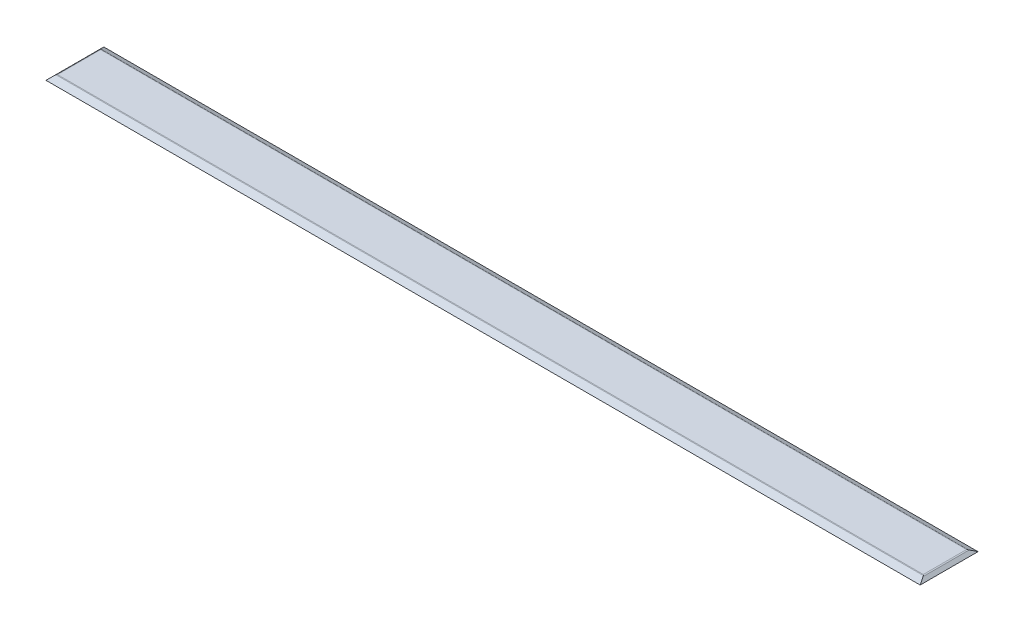
ISO-10303-21;
HEADER;
FILE_DESCRIPTION(('STEP AP214'),'2;1');
FILE_NAME('part.step','',(''),(''),'','','');
FILE_SCHEMA(('AUTOMOTIVE_DESIGN { 1 0 10303 214 1 1 1 1 }'));
ENDSEC;
DATA;
#1=APPLICATION_CONTEXT('core data for automotive mechanical design processes');
#2=APPLICATION_PROTOCOL_DEFINITION('international standard','automotive_design',2000,#1);
#3=PRODUCT_CONTEXT('',#1,'mechanical');
#4=PRODUCT('Part','Part','',(#3));
#5=PRODUCT_RELATED_PRODUCT_CATEGORY('part','',(#4));
#6=PRODUCT_DEFINITION_FORMATION('','',#4);
#7=PRODUCT_DEFINITION_CONTEXT('part definition',#1,'design');
#8=PRODUCT_DEFINITION('design','',#6,#7);
#9=PRODUCT_DEFINITION_SHAPE('','',#8);
#10=(LENGTH_UNIT() NAMED_UNIT(*) SI_UNIT(.MILLI.,.METRE.));
#11=(NAMED_UNIT(*) PLANE_ANGLE_UNIT() SI_UNIT($,.RADIAN.));
#12=(NAMED_UNIT(*) SI_UNIT($,.STERADIAN.) SOLID_ANGLE_UNIT());
#13=UNCERTAINTY_MEASURE_WITH_UNIT(LENGTH_MEASURE(1.E-05),#10,'distance_accuracy_value','');
#14=(GEOMETRIC_REPRESENTATION_CONTEXT(3) GLOBAL_UNCERTAINTY_ASSIGNED_CONTEXT((#13)) GLOBAL_UNIT_ASSIGNED_CONTEXT((#10,
#11,#12)) REPRESENTATION_CONTEXT('',''));
#15=CARTESIAN_POINT('',(0.,0.,0.));
#16=DIRECTION('',(0.,0.,1.));
#17=DIRECTION('',(1.,0.,0.));
#18=AXIS2_PLACEMENT_3D('',#15,#16,#17);
#19=CARTESIAN_POINT('',(1270.,-10.,84.));
#20=DIRECTION('',(0.,1.,0.));
#21=DIRECTION('',(0.,0.,1.));
#22=AXIS2_PLACEMENT_3D('',#19,#20,#21);
#23=PLANE('',#22);
#24=DIRECTION('',(0.,0.,-1.));
#25=VECTOR('',#24,1.);
#26=CARTESIAN_POINT('',(-1270.,-10.,84.));
#27=LINE('',#26,#25);
#28=CARTESIAN_POINT('',(-1270.,-10.,84.));
#29=VERTEX_POINT('',#28);
#30=CARTESIAN_POINT('',(-1270.,-10.,-84.));
#31=VERTEX_POINT('',#30);
#32=EDGE_CURVE('E237',#29,#31,#27,.T.);
#33=ORIENTED_EDGE('',*,*,#32,.T.);
#34=DIRECTION('',(-1.,0.,0.));
#35=VECTOR('',#34,1.);
#36=CARTESIAN_POINT('',(1270.,-10.,-84.));
#37=LINE('',#36,#35);
#38=CARTESIAN_POINT('',(1270.,-10.,-84.));
#39=VERTEX_POINT('',#38);
#40=EDGE_CURVE('E242',#39,#31,#37,.T.);
#41=ORIENTED_EDGE('',*,*,#40,.F.);
#42=DIRECTION('',(0.,0.,-1.));
#43=VECTOR('',#42,1.);
#44=CARTESIAN_POINT('',(1270.,-10.,84.));
#45=LINE('',#44,#43);
#46=CARTESIAN_POINT('',(1270.,-10.,84.));
#47=VERTEX_POINT('',#46);
#48=EDGE_CURVE('E233',#47,#39,#45,.T.);
#49=ORIENTED_EDGE('',*,*,#48,.F.);
#50=DIRECTION('',(-1.,0.,0.));
#51=VECTOR('',#50,1.);
#52=CARTESIAN_POINT('',(1270.,-10.,84.));
#53=LINE('',#52,#51);
#54=EDGE_CURVE('E236',#47,#29,#53,.T.);
#55=ORIENTED_EDGE('',*,*,#54,.T.);
#56=EDGE_LOOP('',(#33,#41,#49,#55));
#57=FACE_BOUND('',#56,.T.);
#58=DIRECTION('',(0.,0.,-1.));
#59=VECTOR('',#58,1.);
#60=CARTESIAN_POINT('',(-1268.58578643763,-10.,64.));
#61=LINE('',#60,#59);
#62=CARTESIAN_POINT('',(-1268.58578643763,-10.,81.7639320225002));
#63=VERTEX_POINT('',#62);
#64=CARTESIAN_POINT('',(-1268.58578643763,-10.,-81.7639320225002));
#65=VERTEX_POINT('',#64);
#66=EDGE_CURVE('E224',#63,#65,#61,.T.);
#67=ORIENTED_EDGE('',*,*,#66,.F.);
#68=DIRECTION('',(-1.,0.,0.));
#69=VECTOR('',#68,1.);
#70=CARTESIAN_POINT('',(1270.,-10.,81.7639320225002));
#71=LINE('',#70,#69);
#72=CARTESIAN_POINT('',(1268.58578643763,-10.,81.7639320225002));
#73=VERTEX_POINT('',#72);
#74=EDGE_CURVE('E228',#73,#63,#71,.T.);
#75=ORIENTED_EDGE('',*,*,#74,.F.);
#76=DIRECTION('',(0.,0.,1.));
#77=VECTOR('',#76,1.);
#78=CARTESIAN_POINT('',(1268.58578643763,-10.,84.));
#79=LINE('',#78,#77);
#80=CARTESIAN_POINT('',(1268.58578643763,-10.,-81.7639320225002));
#81=VERTEX_POINT('',#80);
#82=EDGE_CURVE('E65',#73,#81,#79,.F.);
#83=ORIENTED_EDGE('',*,*,#82,.T.);
#84=DIRECTION('',(-1.,0.,0.));
#85=VECTOR('',#84,1.);
#86=CARTESIAN_POINT('',(1270.,-10.,-81.7639320225002));
#87=LINE('',#86,#85);
#88=EDGE_CURVE('E208',#81,#65,#87,.T.);
#89=ORIENTED_EDGE('',*,*,#88,.T.);
#90=EDGE_LOOP('',(#67,#75,#83,#89));
#91=FACE_BOUND('',#90,.T.);
#92=ADVANCED_FACE('F48',(#57,#91),#23,.F.);
#93=CARTESIAN_POINT('',(1270.,0.,-64.));
#94=DIRECTION('',(0.,-0.894427190999916,0.447213595499957));
#95=DIRECTION('',(0.,-0.447213595499957,-0.894427190999916));
#96=AXIS2_PLACEMENT_3D('',#93,#94,#95);
#97=PLANE('',#96);
#98=DIRECTION('',(-1.,0.,0.));
#99=VECTOR('',#98,1.);
#100=CARTESIAN_POINT('',(1270.,-0.527864045000381,-65.0557280900008));
#101=LINE('',#100,#99);
#102=CARTESIAN_POINT('',(-1260.16500016563,-0.527864045000381,-65.0557280900008));
#103=VERTEX_POINT('',#102);
#104=CARTESIAN_POINT('',(1260.16500016563,-0.527864045000381,-65.0557280900008));
#105=VERTEX_POINT('',#104);
#106=EDGE_CURVE('E262',#103,#105,#101,.F.);
#107=ORIENTED_EDGE('',*,*,#106,.T.);
#108=CARTESIAN_POINT('',(1257.92893218813,-5.,-74.));
#109=DIRECTION('',(0.,-0.894427190999916,0.447213595499957));
#110=DIRECTION('',(0.,-0.447213595499957,-0.894427190999916));
#111=AXIS2_PLACEMENT_3D('',#108,#109,#110);
#112=ELLIPSE('',#111,11.180339887499,5.);
#113=CARTESIAN_POINT('',(1261.46446609407,-1.46446609406725,-66.9289321881345));
#114=VERTEX_POINT('',#113);
#115=EDGE_CURVE('E266',#105,#114,#112,.F.);
#116=ORIENTED_EDGE('',*,*,#115,.T.);
#117=DIRECTION('',(-0.408248290463863,0.408248290463862,0.816496580927727));
#118=VECTOR('',#117,1.);
#119=CARTESIAN_POINT('',(1242.,18.,-27.9999999999999));
#120=LINE('',#119,#118);
#121=EDGE_CURVE('E248',#114,#39,#120,.F.);
#122=ORIENTED_EDGE('',*,*,#121,.T.);
#123=ORIENTED_EDGE('',*,*,#40,.T.);
#124=DIRECTION('',(0.408248290463855,0.408248290463864,0.81649658092773));
#125=VECTOR('',#124,1.);
#126=CARTESIAN_POINT('',(-1217.33333333333,42.666666666667,21.3333333333341));
#127=LINE('',#126,#125);
#128=CARTESIAN_POINT('',(-1261.46446609407,-1.46446609406725,-66.9289321881346));
#129=VERTEX_POINT('',#128);
#130=EDGE_CURVE('E250',#31,#129,#127,.T.);
#131=ORIENTED_EDGE('',*,*,#130,.T.);
#132=CARTESIAN_POINT('',(-1257.92893218813,-5.,-74.));
#133=DIRECTION('',(0.,-0.894427190999916,0.447213595499957));
#134=DIRECTION('',(0.,-0.447213595499957,-0.894427190999916));
#135=AXIS2_PLACEMENT_3D('',#132,#133,#134);
#136=ELLIPSE('',#135,11.180339887499,5.);
#137=EDGE_CURVE('E264',#129,#103,#136,.F.);
#138=ORIENTED_EDGE('',*,*,#137,.T.);
#139=EDGE_LOOP('',(#107,#116,#122,#123,#131,#138));
#140=FACE_BOUND('',#139,.T.);
#141=ADVANCED_FACE('F320',(#140),#97,.F.);
#142=CARTESIAN_POINT('',(1270.,0.,64.));
#143=DIRECTION('',(0.,-1.,0.));
#144=DIRECTION('',(0.,0.,-1.));
#145=AXIS2_PLACEMENT_3D('',#142,#143,#144);
#146=PLANE('',#145);
#147=DIRECTION('',(-1.,0.,0.));
#148=VECTOR('',#147,1.);
#149=CARTESIAN_POINT('',(1270.,0.,62.819660112501));
#150=LINE('',#149,#148);
#151=CARTESIAN_POINT('',(-1257.92893218813,0.,62.819660112501));
#152=VERTEX_POINT('',#151);
#153=CARTESIAN_POINT('',(1257.92893218813,0.,62.819660112501));
#154=VERTEX_POINT('',#153);
#155=EDGE_CURVE('E257',#152,#154,#150,.F.);
#156=ORIENTED_EDGE('',*,*,#155,.T.);
#157=DIRECTION('',(0.,0.,1.));
#158=VECTOR('',#157,1.);
#159=CARTESIAN_POINT('',(1257.92893218813,0.,-64.));
#160=LINE('',#159,#158);
#161=CARTESIAN_POINT('',(1257.92893218813,0.,-62.819660112501));
#162=VERTEX_POINT('',#161);
#163=EDGE_CURVE('E259',#154,#162,#160,.F.);
#164=ORIENTED_EDGE('',*,*,#163,.T.);
#165=DIRECTION('',(-1.,0.,0.));
#166=VECTOR('',#165,1.);
#167=CARTESIAN_POINT('',(1270.,0.,-62.819660112501));
#168=LINE('',#167,#166);
#169=CARTESIAN_POINT('',(-1257.92893218813,0.,-62.819660112501));
#170=VERTEX_POINT('',#169);
#171=EDGE_CURVE('E253',#162,#170,#168,.T.);
#172=ORIENTED_EDGE('',*,*,#171,.T.);
#173=DIRECTION('',(0.,0.,1.));
#174=VECTOR('',#173,1.);
#175=CARTESIAN_POINT('',(-1257.92893218813,0.,64.0000000000001));
#176=LINE('',#175,#174);
#177=EDGE_CURVE('E255',#170,#152,#176,.T.);
#178=ORIENTED_EDGE('',*,*,#177,.T.);
#179=EDGE_LOOP('',(#156,#164,#172,#178));
#180=FACE_BOUND('',#179,.T.);
#181=ADVANCED_FACE('F317',(#180),#146,.F.);
#182=CARTESIAN_POINT('',(1270.,-10.,84.));
#183=DIRECTION('',(0.,-0.894427190999916,-0.447213595499958));
#184=DIRECTION('',(0.,0.447213595499958,-0.894427190999916));
#185=AXIS2_PLACEMENT_3D('',#182,#183,#184);
#186=PLANE('',#185);
#187=DIRECTION('',(0.408248290463863,-0.408248290463863,0.816496580927726));
#188=VECTOR('',#187,1.);
#189=CARTESIAN_POINT('',(1242.,18.,28.));
#190=LINE('',#189,#188);
#191=CARTESIAN_POINT('',(1261.46446609407,-1.46446609406725,66.9289321881345));
#192=VERTEX_POINT('',#191);
#193=EDGE_CURVE('E244',#47,#192,#190,.F.);
#194=ORIENTED_EDGE('',*,*,#193,.T.);
#195=CARTESIAN_POINT('',(1257.92893218813,-5.,74.));
#196=DIRECTION('',(0.,-0.894427190999916,-0.447213595499958));
#197=DIRECTION('',(0.,0.447213595499958,-0.894427190999916));
#198=AXIS2_PLACEMENT_3D('',#195,#196,#197);
#199=ELLIPSE('',#198,11.180339887499,5.);
#200=CARTESIAN_POINT('',(1260.16500016563,-0.527864045000381,65.0557280900008));
#201=VERTEX_POINT('',#200);
#202=EDGE_CURVE('E57',#192,#201,#199,.F.);
#203=ORIENTED_EDGE('',*,*,#202,.T.);
#204=DIRECTION('',(-1.,0.,0.));
#205=VECTOR('',#204,1.);
#206=CARTESIAN_POINT('',(1270.,-0.527864045000381,65.0557280900008));
#207=LINE('',#206,#205);
#208=CARTESIAN_POINT('',(-1260.16500016563,-0.527864045000381,65.0557280900008));
#209=VERTEX_POINT('',#208);
#210=EDGE_CURVE('E273',#201,#209,#207,.T.);
#211=ORIENTED_EDGE('',*,*,#210,.T.);
#212=CARTESIAN_POINT('',(-1257.92893218813,-5.,74.));
#213=DIRECTION('',(0.,-0.894427190999916,-0.447213595499958));
#214=DIRECTION('',(0.,0.447213595499958,-0.894427190999916));
#215=AXIS2_PLACEMENT_3D('',#212,#213,#214);
#216=ELLIPSE('',#215,11.180339887499,5.);
#217=CARTESIAN_POINT('',(-1261.46446609407,-1.46446609406725,66.9289321881346));
#218=VERTEX_POINT('',#217);
#219=EDGE_CURVE('E271',#209,#218,#216,.F.);
#220=ORIENTED_EDGE('',*,*,#219,.T.);
#221=DIRECTION('',(-0.408248290463855,-0.408248290463864,0.816496580927729));
#222=VECTOR('',#221,1.);
#223=CARTESIAN_POINT('',(-1260.,0.,64.));
#224=LINE('',#223,#222);
#225=EDGE_CURVE('E246',#218,#29,#224,.T.);
#226=ORIENTED_EDGE('',*,*,#225,.T.);
#227=ORIENTED_EDGE('',*,*,#54,.F.);
#228=EDGE_LOOP('',(#194,#203,#211,#220,#226,#227));
#229=FACE_BOUND('',#228,.T.);
#230=ADVANCED_FACE('F297',(#229),#186,.F.);
#231=CARTESIAN_POINT('',(-1260.,0.,64.));
#232=DIRECTION('',(-0.707106781186555,0.70710678118654,0.));
#233=DIRECTION('',(0.,0.,-1.));
#234=AXIS2_PLACEMENT_3D('',#231,#232,#233);
#235=PLANE('',#234);
#236=ORIENTED_EDGE('',*,*,#225,.F.);
#237=DIRECTION('',(0.,0.,1.));
#238=VECTOR('',#237,1.);
#239=CARTESIAN_POINT('',(-1261.46446609407,-1.46446609406692,-63.9999999999999));
#240=LINE('',#239,#238);
#241=EDGE_CURVE('E13',#218,#129,#240,.F.);
#242=ORIENTED_EDGE('',*,*,#241,.T.);
#243=ORIENTED_EDGE('',*,*,#130,.F.);
#244=ORIENTED_EDGE('',*,*,#32,.F.);
#245=EDGE_LOOP('',(#236,#242,#243,#244));
#246=FACE_BOUND('',#245,.T.);
#247=ADVANCED_FACE('F301',(#246),#235,.T.);
#248=CARTESIAN_POINT('',(1270.,-10.,0.));
#249=DIRECTION('',(-0.707106781186547,-0.707106781186548,0.));
#250=DIRECTION('',(0.,0.,1.));
#251=AXIS2_PLACEMENT_3D('',#248,#249,#250);
#252=PLANE('',#251);
#253=ORIENTED_EDGE('',*,*,#121,.F.);
#254=DIRECTION('',(0.,0.,-1.));
#255=VECTOR('',#254,1.);
#256=CARTESIAN_POINT('',(1261.46446609407,-1.46446609406725,64.));
#257=LINE('',#256,#255);
#258=EDGE_CURVE('E268',#114,#192,#257,.F.);
#259=ORIENTED_EDGE('',*,*,#258,.T.);
#260=ORIENTED_EDGE('',*,*,#193,.F.);
#261=ORIENTED_EDGE('',*,*,#48,.T.);
#262=EDGE_LOOP('',(#253,#259,#260,#261));
#263=FACE_BOUND('',#262,.T.);
#264=ADVANCED_FACE('F309',(#263),#252,.F.);
#265=CARTESIAN_POINT('',(-1257.92893218813,-5.,64.));
#266=DIRECTION('',(0.,0.,-1.));
#267=DIRECTION('',(-1.,0.,0.));
#268=AXIS2_PLACEMENT_3D('',#265,#266,#267);
#269=CYLINDRICAL_SURFACE('',#268,5.);
#270=ORIENTED_EDGE('',*,*,#241,.F.);
#271=ORIENTED_EDGE('',*,*,#219,.F.);
#272=CARTESIAN_POINT('',(-1257.92893218813,-5.,62.819660112501));
#273=DIRECTION('',(-0.707106781186547,0.,-0.707106781186548));
#274=DIRECTION('',(0.707106781186547,0.,-0.707106781186548));
#275=AXIS2_PLACEMENT_3D('',#272,#273,#274);
#276=ELLIPSE('',#275,7.07106781186547,5.);
#277=EDGE_CURVE('E52',#152,#209,#276,.F.);
#278=ORIENTED_EDGE('',*,*,#277,.F.);
#279=ORIENTED_EDGE('',*,*,#177,.F.);
#280=CARTESIAN_POINT('',(-1257.92893218813,-5.,-62.819660112501));
#281=DIRECTION('',(-0.707106781186547,0.,0.707106781186547));
#282=DIRECTION('',(-0.707106781186547,0.,-0.707106781186547));
#283=AXIS2_PLACEMENT_3D('',#280,#281,#282);
#284=ELLIPSE('',#283,7.07106781186547,5.);
#285=EDGE_CURVE('E279',#103,#170,#284,.F.);
#286=ORIENTED_EDGE('',*,*,#285,.F.);
#287=ORIENTED_EDGE('',*,*,#137,.F.);
#288=EDGE_LOOP('',(#270,#271,#278,#279,#286,#287));
#289=FACE_BOUND('',#288,.T.);
#290=ADVANCED_FACE('F50',(#289),#269,.T.);
#291=CARTESIAN_POINT('',(1270.,-5.,62.819660112501));
#292=DIRECTION('',(-1.,0.,0.));
#293=DIRECTION('',(0.,0.,1.));
#294=AXIS2_PLACEMENT_3D('',#291,#292,#293);
#295=CYLINDRICAL_SURFACE('',#294,5.);
#296=ORIENTED_EDGE('',*,*,#277,.T.);
#297=ORIENTED_EDGE('',*,*,#210,.F.);
#298=CARTESIAN_POINT('',(1257.92893218813,-5.,62.819660112501));
#299=DIRECTION('',(-0.707106781186547,0.,0.707106781186548));
#300=DIRECTION('',(-0.707106781186547,0.,-0.707106781186548));
#301=AXIS2_PLACEMENT_3D('',#298,#299,#300);
#302=ELLIPSE('',#301,7.07106781186547,5.);
#303=EDGE_CURVE('E277',#154,#201,#302,.F.);
#304=ORIENTED_EDGE('',*,*,#303,.F.);
#305=ORIENTED_EDGE('',*,*,#155,.F.);
#306=EDGE_LOOP('',(#296,#297,#304,#305));
#307=FACE_BOUND('',#306,.T.);
#308=ADVANCED_FACE('F289',(#307),#295,.T.);
#309=CARTESIAN_POINT('',(1270.,-5.,-62.819660112501));
#310=DIRECTION('',(-1.,0.,0.));
#311=DIRECTION('',(0.,0.,1.));
#312=AXIS2_PLACEMENT_3D('',#309,#310,#311);
#313=CYLINDRICAL_SURFACE('',#312,5.);
#314=ORIENTED_EDGE('',*,*,#285,.T.);
#315=ORIENTED_EDGE('',*,*,#171,.F.);
#316=CARTESIAN_POINT('',(1257.92893218813,-5.,-62.819660112501));
#317=DIRECTION('',(-0.707106781186547,0.,-0.707106781186547));
#318=DIRECTION('',(-0.707106781186547,0.,0.707106781186547));
#319=AXIS2_PLACEMENT_3D('',#316,#317,#318);
#320=ELLIPSE('',#319,7.07106781186547,5.);
#321=EDGE_CURVE('E205',#105,#162,#320,.F.);
#322=ORIENTED_EDGE('',*,*,#321,.F.);
#323=ORIENTED_EDGE('',*,*,#106,.F.);
#324=EDGE_LOOP('',(#314,#315,#322,#323));
#325=FACE_BOUND('',#324,.T.);
#326=ADVANCED_FACE('F318',(#325),#313,.T.);
#327=CARTESIAN_POINT('',(1257.92893218813,-5.,64.));
#328=DIRECTION('',(0.,0.,-1.));
#329=DIRECTION('',(-1.,0.,0.));
#330=AXIS2_PLACEMENT_3D('',#327,#328,#329);
#331=CYLINDRICAL_SURFACE('',#330,5.);
#332=ORIENTED_EDGE('',*,*,#202,.F.);
#333=ORIENTED_EDGE('',*,*,#258,.F.);
#334=ORIENTED_EDGE('',*,*,#115,.F.);
#335=ORIENTED_EDGE('',*,*,#321,.T.);
#336=ORIENTED_EDGE('',*,*,#163,.F.);
#337=ORIENTED_EDGE('',*,*,#303,.T.);
#338=EDGE_LOOP('',(#332,#333,#334,#335,#336,#337));
#339=FACE_BOUND('',#338,.T.);
#340=ADVANCED_FACE('F313',(#339),#331,.T.);
#341=CARTESIAN_POINT('',(1270.,-0.894427190999969,-63.5527864045));
#342=DIRECTION('',(0.,-0.894427190999916,0.447213595499957));
#343=DIRECTION('',(0.,-0.447213595499957,-0.894427190999916));
#344=AXIS2_PLACEMENT_3D('',#341,#342,#343);
#345=PLANE('',#344);
#346=DIRECTION('',(1.,0.,0.));
#347=VECTOR('',#346,1.);
#348=CARTESIAN_POINT('',(1270.,-1.42229123600035,-64.6085144945009));
#349=LINE('',#348,#347);
#350=CARTESIAN_POINT('',(-1259.71778657013,-1.42229123600035,-64.6085144945009));
#351=VERTEX_POINT('',#350);
#352=CARTESIAN_POINT('',(1259.71778657013,-1.42229123600035,-64.6085144945009));
#353=VERTEX_POINT('',#352);
#354=EDGE_CURVE('E162',#351,#353,#349,.T.);
#355=ORIENTED_EDGE('',*,*,#354,.F.);
#356=CARTESIAN_POINT('',(-1257.92893218813,-5.,-71.7639320225002));
#357=DIRECTION('',(0.,-0.894427190999916,0.447213595499957));
#358=DIRECTION('',(0.,-0.447213595499957,-0.894427190999916));
#359=AXIS2_PLACEMENT_3D('',#356,#357,#358);
#360=ELLIPSE('',#359,8.94427190999918,4.);
#361=CARTESIAN_POINT('',(-1260.75735931288,-2.17157287525382,-66.1070777730079));
#362=VERTEX_POINT('',#361);
#363=EDGE_CURVE('E172',#362,#351,#360,.F.);
#364=ORIENTED_EDGE('',*,*,#363,.F.);
#365=DIRECTION('',(0.408248290463855,0.408248290463864,0.81649658092773));
#366=VECTOR('',#365,1.);
#367=CARTESIAN_POINT('',(-1216.90017802386,41.6856084137714,21.607284805043));
#368=LINE('',#367,#366);
#369=EDGE_CURVE('E196',#65,#362,#368,.T.);
#370=ORIENTED_EDGE('',*,*,#369,.F.);
#371=ORIENTED_EDGE('',*,*,#88,.F.);
#372=DIRECTION('',(-0.408248290463863,0.408248290463862,0.816496580927727));
#373=VECTOR('',#372,1.);
#374=CARTESIAN_POINT('',(1241.56684469052,17.0189417471045,-27.726048528291));
#375=LINE('',#374,#373);
#376=CARTESIAN_POINT('',(1260.75735931288,-2.17157287525382,-66.1070777730078));
#377=VERTEX_POINT('',#376);
#378=EDGE_CURVE('E187',#377,#81,#375,.F.);
#379=ORIENTED_EDGE('',*,*,#378,.F.);
#380=CARTESIAN_POINT('',(1257.92893218813,-5.,-71.7639320225002));
#381=DIRECTION('',(0.,-0.894427190999916,0.447213595499957));
#382=DIRECTION('',(0.,-0.447213595499957,-0.894427190999916));
#383=AXIS2_PLACEMENT_3D('',#380,#381,#382);
#384=ELLIPSE('',#383,8.94427190999918,4.);
#385=EDGE_CURVE('E179',#353,#377,#384,.F.);
#386=ORIENTED_EDGE('',*,*,#385,.F.);
#387=EDGE_LOOP('',(#355,#364,#370,#371,#379,#386));
#388=FACE_BOUND('',#387,.T.);
#389=ADVANCED_FACE('F185',(#388),#345,.T.);
#390=CARTESIAN_POINT('',(1270.,-1.,64.));
#391=DIRECTION('',(0.,-1.,0.));
#392=DIRECTION('',(0.,0.,-1.));
#393=AXIS2_PLACEMENT_3D('',#390,#391,#392);
#394=PLANE('',#393);
#395=DIRECTION('',(1.,0.,0.));
#396=VECTOR('',#395,1.);
#397=CARTESIAN_POINT('',(1270.,-1.,62.819660112501));
#398=LINE('',#397,#396);
#399=CARTESIAN_POINT('',(-1257.92893218813,-1.,62.819660112501));
#400=VERTEX_POINT('',#399);
#401=CARTESIAN_POINT('',(1257.92893218813,-1.,62.819660112501));
#402=VERTEX_POINT('',#401);
#403=EDGE_CURVE('E214',#400,#402,#398,.T.);
#404=ORIENTED_EDGE('',*,*,#403,.F.);
#405=DIRECTION('',(0.,0.,-1.));
#406=VECTOR('',#405,1.);
#407=CARTESIAN_POINT('',(-1257.92893218813,-1.,64.));
#408=LINE('',#407,#406);
#409=CARTESIAN_POINT('',(-1257.92893218813,-1.,-62.819660112501));
#410=VERTEX_POINT('',#409);
#411=EDGE_CURVE('E218',#410,#400,#408,.F.);
#412=ORIENTED_EDGE('',*,*,#411,.F.);
#413=DIRECTION('',(1.,0.,0.));
#414=VECTOR('',#413,1.);
#415=CARTESIAN_POINT('',(1270.,-1.,-62.819660112501));
#416=LINE('',#415,#414);
#417=CARTESIAN_POINT('',(1257.92893218813,-1.,-62.819660112501));
#418=VERTEX_POINT('',#417);
#419=EDGE_CURVE('E199',#418,#410,#416,.F.);
#420=ORIENTED_EDGE('',*,*,#419,.F.);
#421=DIRECTION('',(0.,0.,-1.));
#422=VECTOR('',#421,1.);
#423=CARTESIAN_POINT('',(1257.92893218813,-1.,64.));
#424=LINE('',#423,#422);
#425=EDGE_CURVE('E173',#402,#418,#424,.T.);
#426=ORIENTED_EDGE('',*,*,#425,.F.);
#427=EDGE_LOOP('',(#404,#412,#420,#426));
#428=FACE_BOUND('',#427,.T.);
#429=ADVANCED_FACE('F388',(#428),#394,.T.);
#430=CARTESIAN_POINT('',(1270.,-10.8944271909999,83.5527864045001));
#431=DIRECTION('',(0.,-0.894427190999916,-0.447213595499958));
#432=DIRECTION('',(0.,0.447213595499958,-0.894427190999916));
#433=AXIS2_PLACEMENT_3D('',#430,#431,#432);
#434=PLANE('',#433);
#435=DIRECTION('',(0.408248290463863,-0.408248290463863,0.816496580927726));
#436=VECTOR('',#435,1.);
#437=CARTESIAN_POINT('',(1241.56684469052,17.0189417471045,27.7260485282911));
#438=LINE('',#437,#436);
#439=CARTESIAN_POINT('',(1260.75735931288,-2.17157287525382,66.1070777730078));
#440=VERTEX_POINT('',#439);
#441=EDGE_CURVE('E202',#73,#440,#438,.F.);
#442=ORIENTED_EDGE('',*,*,#441,.F.);
#443=ORIENTED_EDGE('',*,*,#74,.T.);
#444=DIRECTION('',(-0.408248290463855,-0.408248290463864,0.816496580927729));
#445=VECTOR('',#444,1.);
#446=CARTESIAN_POINT('',(-1259.56684469052,-0.981058252895406,63.7260485282911));
#447=LINE('',#446,#445);
#448=CARTESIAN_POINT('',(-1260.75735931288,-2.17157287525382,66.1070777730079));
#449=VERTEX_POINT('',#448);
#450=EDGE_CURVE('E197',#449,#63,#447,.T.);
#451=ORIENTED_EDGE('',*,*,#450,.F.);
#452=CARTESIAN_POINT('',(-1257.92893218813,-5.,71.7639320225002));
#453=DIRECTION('',(0.,-0.894427190999916,-0.447213595499958));
#454=DIRECTION('',(0.,0.447213595499958,-0.894427190999916));
#455=AXIS2_PLACEMENT_3D('',#452,#453,#454);
#456=ELLIPSE('',#455,8.94427190999916,4.);
#457=CARTESIAN_POINT('',(-1259.71778657013,-1.42229123600035,64.6085144945009));
#458=VERTEX_POINT('',#457);
#459=EDGE_CURVE('E191',#458,#449,#456,.F.);
#460=ORIENTED_EDGE('',*,*,#459,.F.);
#461=DIRECTION('',(1.,0.,0.));
#462=VECTOR('',#461,1.);
#463=CARTESIAN_POINT('',(1270.,-1.42229123600035,64.6085144945009));
#464=LINE('',#463,#462);
#465=CARTESIAN_POINT('',(1259.71778657013,-1.42229123600035,64.6085144945009));
#466=VERTEX_POINT('',#465);
#467=EDGE_CURVE('E210',#466,#458,#464,.F.);
#468=ORIENTED_EDGE('',*,*,#467,.F.);
#469=CARTESIAN_POINT('',(1257.92893218813,-5.,71.7639320225002));
#470=DIRECTION('',(0.,-0.894427190999916,-0.447213595499958));
#471=DIRECTION('',(0.,0.447213595499958,-0.894427190999916));
#472=AXIS2_PLACEMENT_3D('',#469,#470,#471);
#473=ELLIPSE('',#472,8.94427190999916,4.);
#474=EDGE_CURVE('E206',#440,#466,#473,.F.);
#475=ORIENTED_EDGE('',*,*,#474,.F.);
#476=EDGE_LOOP('',(#442,#443,#451,#460,#468,#475));
#477=FACE_BOUND('',#476,.T.);
#478=ADVANCED_FACE('F384',(#477),#434,.T.);
#479=CARTESIAN_POINT('',(-1259.29289321881,-0.707106781186573,64.));
#480=DIRECTION('',(-0.707106781186555,0.70710678118654,0.));
#481=DIRECTION('',(0.,0.,-1.));
#482=AXIS2_PLACEMENT_3D('',#479,#480,#481);
#483=PLANE('',#482);
#484=ORIENTED_EDGE('',*,*,#450,.T.);
#485=ORIENTED_EDGE('',*,*,#66,.T.);
#486=ORIENTED_EDGE('',*,*,#369,.T.);
#487=DIRECTION('',(0.,0.,-1.));
#488=VECTOR('',#487,1.);
#489=CARTESIAN_POINT('',(-1260.75735931288,-2.17157287525382,64.));
#490=LINE('',#489,#488);
#491=EDGE_CURVE('E203',#449,#362,#490,.T.);
#492=ORIENTED_EDGE('',*,*,#491,.F.);
#493=EDGE_LOOP('',(#484,#485,#486,#492));
#494=FACE_BOUND('',#493,.T.);
#495=ADVANCED_FACE('F381',(#494),#483,.F.);
#496=CARTESIAN_POINT('',(1269.29289321881,-10.7071067811866,0.));
#497=DIRECTION('',(-0.707106781186547,-0.707106781186548,0.));
#498=DIRECTION('',(0.,0.,1.));
#499=AXIS2_PLACEMENT_3D('',#496,#497,#498);
#500=PLANE('',#499);
#501=ORIENTED_EDGE('',*,*,#378,.T.);
#502=ORIENTED_EDGE('',*,*,#82,.F.);
#503=ORIENTED_EDGE('',*,*,#441,.T.);
#504=DIRECTION('',(0.,0.,1.));
#505=VECTOR('',#504,1.);
#506=CARTESIAN_POINT('',(1260.75735931288,-2.17157287525382,0.));
#507=LINE('',#506,#505);
#508=EDGE_CURVE('E189',#377,#440,#507,.T.);
#509=ORIENTED_EDGE('',*,*,#508,.F.);
#510=EDGE_LOOP('',(#501,#502,#503,#509));
#511=FACE_BOUND('',#510,.T.);
#512=ADVANCED_FACE('F377',(#511),#500,.T.);
#513=CARTESIAN_POINT('',(-1257.92893218813,-5.,64.));
#514=DIRECTION('',(0.,0.,-1.));
#515=DIRECTION('',(-1.,0.,0.));
#516=AXIS2_PLACEMENT_3D('',#513,#514,#515);
#517=CYLINDRICAL_SURFACE('',#516,4.);
#518=ORIENTED_EDGE('',*,*,#491,.T.);
#519=ORIENTED_EDGE('',*,*,#363,.T.);
#520=CARTESIAN_POINT('',(-1257.92893218813,-5.,-62.819660112501));
#521=DIRECTION('',(-0.707106781186547,0.,0.707106781186547));
#522=DIRECTION('',(-0.707106781186547,0.,-0.707106781186547));
#523=AXIS2_PLACEMENT_3D('',#520,#521,#522);
#524=ELLIPSE('',#523,5.65685424949238,4.);
#525=EDGE_CURVE('E168',#351,#410,#524,.F.);
#526=ORIENTED_EDGE('',*,*,#525,.T.);
#527=ORIENTED_EDGE('',*,*,#411,.T.);
#528=CARTESIAN_POINT('',(-1257.92893218813,-5.,62.819660112501));
#529=DIRECTION('',(-0.707106781186547,0.,-0.707106781186548));
#530=DIRECTION('',(-0.707106781186547,0.,0.707106781186548));
#531=AXIS2_PLACEMENT_3D('',#528,#529,#530);
#532=ELLIPSE('',#531,5.65685424949238,4.);
#533=EDGE_CURVE('E221',#400,#458,#532,.F.);
#534=ORIENTED_EDGE('',*,*,#533,.T.);
#535=ORIENTED_EDGE('',*,*,#459,.T.);
#536=EDGE_LOOP('',(#518,#519,#526,#527,#534,#535));
#537=FACE_BOUND('',#536,.T.);
#538=ADVANCED_FACE('F373',(#537),#517,.F.);
#539=CARTESIAN_POINT('',(1270.,-5.,62.819660112501));
#540=DIRECTION('',(-1.,0.,0.));
#541=DIRECTION('',(0.,0.,1.));
#542=AXIS2_PLACEMENT_3D('',#539,#540,#541);
#543=CYLINDRICAL_SURFACE('',#542,4.);
#544=ORIENTED_EDGE('',*,*,#533,.F.);
#545=ORIENTED_EDGE('',*,*,#403,.T.);
#546=CARTESIAN_POINT('',(1257.92893218813,-5.,62.819660112501));
#547=DIRECTION('',(0.707106781186547,0.,-0.707106781186548));
#548=DIRECTION('',(-0.707106781186547,0.,-0.707106781186548));
#549=AXIS2_PLACEMENT_3D('',#546,#547,#548);
#550=ELLIPSE('',#549,5.65685424949238,4.);
#551=EDGE_CURVE('E183',#402,#466,#550,.T.);
#552=ORIENTED_EDGE('',*,*,#551,.T.);
#553=ORIENTED_EDGE('',*,*,#467,.T.);
#554=EDGE_LOOP('',(#544,#545,#552,#553));
#555=FACE_BOUND('',#554,.T.);
#556=ADVANCED_FACE('F370',(#555),#543,.F.);
#557=CARTESIAN_POINT('',(1270.,-5.,-62.819660112501));
#558=DIRECTION('',(-1.,0.,0.));
#559=DIRECTION('',(0.,0.,1.));
#560=AXIS2_PLACEMENT_3D('',#557,#558,#559);
#561=CYLINDRICAL_SURFACE('',#560,4.);
#562=ORIENTED_EDGE('',*,*,#525,.F.);
#563=ORIENTED_EDGE('',*,*,#354,.T.);
#564=CARTESIAN_POINT('',(1257.92893218813,-5.,-62.819660112501));
#565=DIRECTION('',(-0.707106781186547,0.,-0.707106781186547));
#566=DIRECTION('',(0.707106781186547,0.,-0.707106781186547));
#567=AXIS2_PLACEMENT_3D('',#564,#565,#566);
#568=ELLIPSE('',#567,5.65685424949238,4.);
#569=EDGE_CURVE('E165',#353,#418,#568,.F.);
#570=ORIENTED_EDGE('',*,*,#569,.T.);
#571=ORIENTED_EDGE('',*,*,#419,.T.);
#572=EDGE_LOOP('',(#562,#563,#570,#571));
#573=FACE_BOUND('',#572,.T.);
#574=ADVANCED_FACE('F164',(#573),#561,.F.);
#575=CARTESIAN_POINT('',(1257.92893218813,-5.,64.));
#576=DIRECTION('',(0.,0.,-1.));
#577=DIRECTION('',(-1.,0.,0.));
#578=AXIS2_PLACEMENT_3D('',#575,#576,#577);
#579=CYLINDRICAL_SURFACE('',#578,4.);
#580=ORIENTED_EDGE('',*,*,#474,.T.);
#581=ORIENTED_EDGE('',*,*,#551,.F.);
#582=ORIENTED_EDGE('',*,*,#425,.T.);
#583=ORIENTED_EDGE('',*,*,#569,.F.);
#584=ORIENTED_EDGE('',*,*,#385,.T.);
#585=ORIENTED_EDGE('',*,*,#508,.T.);
#586=EDGE_LOOP('',(#580,#581,#582,#583,#584,#585));
#587=FACE_BOUND('',#586,.T.);
#588=ADVANCED_FACE('F177',(#587),#579,.F.);
#589=CLOSED_SHELL('',(#92,#141,#181,#230,#247,#264,#290,#308,#326,#340,#389,#429,#478,#495,#512,
#538,#556,#574,#588));
#590=MANIFOLD_SOLID_BREP('B2',#589);
#591=ADVANCED_BREP_SHAPE_REPRESENTATION('',(#18,#590),#14);
#592=SHAPE_DEFINITION_REPRESENTATION(#9,#591);
ENDSEC;
END-ISO-10303-21;
